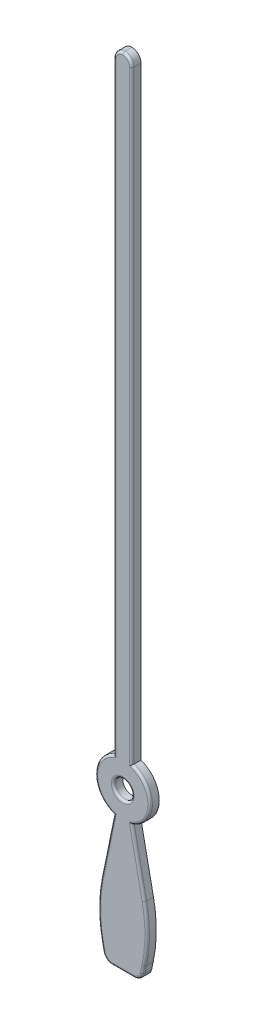
ISO-10303-21;
HEADER;
FILE_DESCRIPTION(('STEP AP214'),'2;1');
FILE_NAME('part.step','',(''),(''),'','','');
FILE_SCHEMA(('AUTOMOTIVE_DESIGN { 1 0 10303 214 1 1 1 1 }'));
ENDSEC;
DATA;
#1=APPLICATION_CONTEXT('core data for automotive mechanical design processes');
#2=APPLICATION_PROTOCOL_DEFINITION('international standard','automotive_design',2000,#1);
#3=PRODUCT_CONTEXT('',#1,'mechanical');
#4=PRODUCT('Part','Part','',(#3));
#5=PRODUCT_RELATED_PRODUCT_CATEGORY('part','',(#4));
#6=PRODUCT_DEFINITION_FORMATION('','',#4);
#7=PRODUCT_DEFINITION_CONTEXT('part definition',#1,'design');
#8=PRODUCT_DEFINITION('design','',#6,#7);
#9=PRODUCT_DEFINITION_SHAPE('','',#8);
#10=(LENGTH_UNIT() NAMED_UNIT(*) SI_UNIT(.MILLI.,.METRE.));
#11=(NAMED_UNIT(*) PLANE_ANGLE_UNIT() SI_UNIT($,.RADIAN.));
#12=(NAMED_UNIT(*) SI_UNIT($,.STERADIAN.) SOLID_ANGLE_UNIT());
#13=UNCERTAINTY_MEASURE_WITH_UNIT(LENGTH_MEASURE(1.E-05),#10,'distance_accuracy_value','');
#14=(GEOMETRIC_REPRESENTATION_CONTEXT(3) GLOBAL_UNCERTAINTY_ASSIGNED_CONTEXT((#13)) GLOBAL_UNIT_ASSIGNED_CONTEXT((#10,
#11,#12)) REPRESENTATION_CONTEXT('',''));
#15=CARTESIAN_POINT('',(0.,0.,0.));
#16=DIRECTION('',(0.,0.,1.));
#17=DIRECTION('',(1.,0.,0.));
#18=AXIS2_PLACEMENT_3D('',#15,#16,#17);
#19=CARTESIAN_POINT('',(0.,0.,0.2));
#20=DIRECTION('',(0.,0.,-1.));
#21=DIRECTION('',(-1.,0.,0.));
#22=AXIS2_PLACEMENT_3D('',#19,#20,#21);
#23=CYLINDRICAL_SURFACE('',#22,0.6);
#24=DIRECTION('',(0.,0.,1.));
#25=VECTOR('',#24,1.);
#26=CARTESIAN_POINT('',(0.2,0.565685424949238,0.));
#27=LINE('',#26,#25);
#28=CARTESIAN_POINT('',(0.2,0.565685424949238,0.));
#29=VERTEX_POINT('',#28);
#30=CARTESIAN_POINT('',(0.2,0.565685424949238,0.15));
#31=VERTEX_POINT('',#30);
#32=EDGE_CURVE('E537',#29,#31,#27,.T.);
#33=ORIENTED_EDGE('',*,*,#32,.T.);
#34=CARTESIAN_POINT('',(0.,0.,0.15));
#35=DIRECTION('',(0.,0.,1.));
#36=DIRECTION('',(1.,0.,0.));
#37=AXIS2_PLACEMENT_3D('',#34,#35,#36);
#38=CIRCLE('',#37,0.6);
#39=CARTESIAN_POINT('',(0.2,-0.565685424949238,0.15));
#40=VERTEX_POINT('',#39);
#41=EDGE_CURVE('E43',#31,#40,#38,.F.);
#42=ORIENTED_EDGE('',*,*,#41,.T.);
#43=DIRECTION('',(0.,0.,1.));
#44=VECTOR('',#43,1.);
#45=CARTESIAN_POINT('',(0.2,-0.565685424949238,0.));
#46=LINE('',#45,#44);
#47=CARTESIAN_POINT('',(0.2,-0.565685424949238,0.));
#48=VERTEX_POINT('',#47);
#49=EDGE_CURVE('E469',#48,#40,#46,.T.);
#50=ORIENTED_EDGE('',*,*,#49,.F.);
#51=CARTESIAN_POINT('',(0.,0.,0.));
#52=DIRECTION('',(0.,0.,1.));
#53=DIRECTION('',(1.,0.,0.));
#54=AXIS2_PLACEMENT_3D('',#51,#52,#53);
#55=CIRCLE('',#54,0.6);
#56=EDGE_CURVE('E219',#48,#29,#55,.T.);
#57=ORIENTED_EDGE('',*,*,#56,.T.);
#58=EDGE_LOOP('',(#33,#42,#50,#57));
#59=FACE_BOUND('',#58,.T.);
#60=ADVANCED_FACE('F34',(#59),#23,.T.);
#61=CARTESIAN_POINT('',(0.,0.,0.2));
#62=DIRECTION('',(0.,0.,1.));
#63=DIRECTION('',(1.,0.,0.));
#64=AXIS2_PLACEMENT_3D('',#61,#62,#63);
#65=PLANE('',#64);
#66=CARTESIAN_POINT('',(0.,0.,0.2));
#67=DIRECTION('',(0.,0.,1.));
#68=DIRECTION('',(1.,0.,0.));
#69=AXIS2_PLACEMENT_3D('',#66,#67,#68);
#70=CIRCLE('',#69,0.25);
#71=CARTESIAN_POINT('',(0.25,0.,0.2));
#72=VERTEX_POINT('',#71);
#73=EDGE_CURVE('E279',#72,#72,#70,.F.);
#74=ORIENTED_EDGE('',*,*,#73,.T.);
#75=EDGE_LOOP('',(#74));
#76=FACE_BOUND('',#75,.T.);
#77=CARTESIAN_POINT('',(0.,13.8,0.2));
#78=DIRECTION('',(0.,0.,1.));
#79=DIRECTION('',(1.,0.,0.));
#80=AXIS2_PLACEMENT_3D('',#77,#78,#79);
#81=CIRCLE('',#80,0.15);
#82=CARTESIAN_POINT('',(0.,13.95,0.2));
#83=VERTEX_POINT('',#82);
#84=CARTESIAN_POINT('',(-0.15,13.8,0.2));
#85=VERTEX_POINT('',#84);
#86=EDGE_CURVE('E274',#83,#85,#81,.T.);
#87=ORIENTED_EDGE('',*,*,#86,.T.);
#88=DIRECTION('',(0.,-1.,0.));
#89=VECTOR('',#88,1.);
#90=CARTESIAN_POINT('',(-0.15,0.,0.2));
#91=LINE('',#90,#89);
#92=CARTESIAN_POINT('',(-0.15,0.529150262212918,0.2));
#93=VERTEX_POINT('',#92);
#94=EDGE_CURVE('E276',#85,#93,#91,.T.);
#95=ORIENTED_EDGE('',*,*,#94,.T.);
#96=CARTESIAN_POINT('',(0.,0.,0.2));
#97=DIRECTION('',(0.,0.,1.));
#98=DIRECTION('',(1.,0.,0.));
#99=AXIS2_PLACEMENT_3D('',#96,#97,#98);
#100=CIRCLE('',#99,0.55);
#101=CARTESIAN_POINT('',(-0.141914989263031,-0.531375701196878,0.2));
#102=VERTEX_POINT('',#101);
#103=EDGE_CURVE('E270',#93,#102,#100,.T.);
#104=ORIENTED_EDGE('',*,*,#103,.T.);
#105=DIRECTION('',(-0.201071669364176,-0.979576532885054,0.));
#106=VECTOR('',#105,1.);
#107=CARTESIAN_POINT('',(-0.0315149301891181,0.00646887650968769,0.2));
#108=LINE('',#107,#106);
#109=CARTESIAN_POINT('',(-0.424628359130431,-1.90869247352332,0.2));
#110=VERTEX_POINT('',#109);
#111=EDGE_CURVE('E264',#102,#110,#108,.T.);
#112=ORIENTED_EDGE('',*,*,#111,.T.);
#113=CARTESIAN_POINT('',(2.46512241288048,-2.50185389814765,0.2));
#114=DIRECTION('',(0.,0.,1.));
#115=DIRECTION('',(1.,0.,0.));
#116=AXIS2_PLACEMENT_3D('',#113,#114,#115);
#117=CIRCLE('',#116,2.95);
#118=CARTESIAN_POINT('',(-0.419677137200519,-3.11864523713717,0.2));
#119=VERTEX_POINT('',#118);
#120=EDGE_CURVE('E262',#110,#119,#117,.T.);
#121=ORIENTED_EDGE('',*,*,#120,.T.);
#122=DIRECTION('',(0.209081809826953,-0.97789815256983,0.));
#123=VECTOR('',#122,1.);
#124=CARTESIAN_POINT('',(-1.03897130264992,-0.222139698030363,0.2));
#125=LINE('',#124,#123);
#126=CARTESIAN_POINT('',(-0.384925916389198,-3.28118044122338,0.2));
#127=VERTEX_POINT('',#126);
#128=EDGE_CURVE('E260',#119,#127,#125,.T.);
#129=ORIENTED_EDGE('',*,*,#128,.T.);
#130=CARTESIAN_POINT('',(-0.238241193503723,-3.24981816974934,0.2));
#131=DIRECTION('',(0.,0.,1.));
#132=DIRECTION('',(1.,0.,0.));
#133=AXIS2_PLACEMENT_3D('',#130,#131,#132);
#134=CIRCLE('',#133,0.15);
#135=CARTESIAN_POINT('',(-0.238241193503723,-3.39981816974934,0.2));
#136=VERTEX_POINT('',#135);
#137=EDGE_CURVE('E258',#127,#136,#134,.T.);
#138=ORIENTED_EDGE('',*,*,#137,.T.);
#139=DIRECTION('',(1.,0.,0.));
#140=VECTOR('',#139,1.);
#141=CARTESIAN_POINT('',(0.,-3.39981816974934,0.2));
#142=LINE('',#141,#140);
#143=CARTESIAN_POINT('',(0.238241193503723,-3.39981816974934,0.2));
#144=VERTEX_POINT('',#143);
#145=EDGE_CURVE('E256',#136,#144,#142,.T.);
#146=ORIENTED_EDGE('',*,*,#145,.T.);
#147=CARTESIAN_POINT('',(0.238241193503723,-3.24981816974934,0.2));
#148=DIRECTION('',(0.,0.,1.));
#149=DIRECTION('',(1.,0.,0.));
#150=AXIS2_PLACEMENT_3D('',#147,#148,#149);
#151=CIRCLE('',#150,0.15);
#152=CARTESIAN_POINT('',(0.384925916389198,-3.28118044122338,0.2));
#153=VERTEX_POINT('',#152);
#154=EDGE_CURVE('E254',#144,#153,#151,.T.);
#155=ORIENTED_EDGE('',*,*,#154,.T.);
#156=DIRECTION('',(0.209081809826953,0.97789815256983,0.));
#157=VECTOR('',#156,1.);
#158=CARTESIAN_POINT('',(1.03897130264992,-0.222139698030363,0.2));
#159=LINE('',#158,#157);
#160=CARTESIAN_POINT('',(0.419677137200518,-3.11864523713717,0.2));
#161=VERTEX_POINT('',#160);
#162=EDGE_CURVE('E252',#153,#161,#159,.T.);
#163=ORIENTED_EDGE('',*,*,#162,.T.);
#164=CARTESIAN_POINT('',(-2.46512241288048,-2.50185389814765,0.2));
#165=DIRECTION('',(0.,0.,1.));
#166=DIRECTION('',(1.,0.,0.));
#167=AXIS2_PLACEMENT_3D('',#164,#165,#166);
#168=CIRCLE('',#167,2.95);
#169=CARTESIAN_POINT('',(0.424628359130431,-1.90869247352332,0.2));
#170=VERTEX_POINT('',#169);
#171=EDGE_CURVE('E247',#161,#170,#168,.T.);
#172=ORIENTED_EDGE('',*,*,#171,.T.);
#173=DIRECTION('',(-0.201071669364176,0.979576532885054,0.));
#174=VECTOR('',#173,1.);
#175=CARTESIAN_POINT('',(0.0315149301891181,0.00646887650968768,0.2));
#176=LINE('',#175,#174);
#177=CARTESIAN_POINT('',(0.141914989263031,-0.531375701196878,0.2));
#178=VERTEX_POINT('',#177);
#179=EDGE_CURVE('E250',#170,#178,#176,.T.);
#180=ORIENTED_EDGE('',*,*,#179,.T.);
#181=CARTESIAN_POINT('',(0.,0.,0.2));
#182=DIRECTION('',(0.,0.,1.));
#183=DIRECTION('',(1.,0.,0.));
#184=AXIS2_PLACEMENT_3D('',#181,#182,#183);
#185=CIRCLE('',#184,0.55);
#186=CARTESIAN_POINT('',(0.15,0.529150262212918,0.2));
#187=VERTEX_POINT('',#186);
#188=EDGE_CURVE('E266',#178,#187,#185,.T.);
#189=ORIENTED_EDGE('',*,*,#188,.T.);
#190=DIRECTION('',(0.,1.,0.));
#191=VECTOR('',#190,1.);
#192=CARTESIAN_POINT('',(0.15,0.,0.2));
#193=LINE('',#192,#191);
#194=CARTESIAN_POINT('',(0.15,13.8,0.2));
#195=VERTEX_POINT('',#194);
#196=EDGE_CURVE('E268',#187,#195,#193,.T.);
#197=ORIENTED_EDGE('',*,*,#196,.T.);
#198=CARTESIAN_POINT('',(0.,13.8,0.2));
#199=DIRECTION('',(0.,0.,1.));
#200=DIRECTION('',(1.,0.,0.));
#201=AXIS2_PLACEMENT_3D('',#198,#199,#200);
#202=CIRCLE('',#201,0.15);
#203=EDGE_CURVE('E272',#195,#83,#202,.T.);
#204=ORIENTED_EDGE('',*,*,#203,.T.);
#205=EDGE_LOOP('',(#87,#95,#104,#112,#121,#129,#138,#146,#155,#163,#172,#180,#189,#197,#204));
#206=FACE_BOUND('',#205,.T.);
#207=ADVANCED_FACE('F414',(#76,#206),#65,.T.);
#208=CARTESIAN_POINT('',(0.,0.,0.));
#209=DIRECTION('',(0.,0.,1.));
#210=DIRECTION('',(1.,0.,0.));
#211=AXIS2_PLACEMENT_3D('',#208,#209,#210);
#212=PLANE('',#211);
#213=DIRECTION('',(0.,-1.,0.));
#214=VECTOR('',#213,1.);
#215=CARTESIAN_POINT('',(-0.2,0.565685424949238,0.));
#216=LINE('',#215,#214);
#217=CARTESIAN_POINT('',(-0.2,13.8,0.));
#218=VERTEX_POINT('',#217);
#219=CARTESIAN_POINT('',(-0.2,0.565685424949238,0.));
#220=VERTEX_POINT('',#219);
#221=EDGE_CURVE('E535',#218,#220,#216,.T.);
#222=ORIENTED_EDGE('',*,*,#221,.F.);
#223=CARTESIAN_POINT('',(0.,13.8,0.));
#224=DIRECTION('',(0.,0.,1.));
#225=DIRECTION('',(1.,0.,0.));
#226=AXIS2_PLACEMENT_3D('',#223,#224,#225);
#227=CIRCLE('',#226,0.2);
#228=CARTESIAN_POINT('',(0.,14.,0.));
#229=VERTEX_POINT('',#228);
#230=EDGE_CURVE('E232',#218,#229,#227,.F.);
#231=ORIENTED_EDGE('',*,*,#230,.T.);
#232=CARTESIAN_POINT('',(0.,13.8,0.));
#233=DIRECTION('',(0.,0.,1.));
#234=DIRECTION('',(1.,0.,0.));
#235=AXIS2_PLACEMENT_3D('',#232,#233,#234);
#236=CIRCLE('',#235,0.2);
#237=CARTESIAN_POINT('',(0.2,13.8,0.));
#238=VERTEX_POINT('',#237);
#239=EDGE_CURVE('E230',#229,#238,#236,.F.);
#240=ORIENTED_EDGE('',*,*,#239,.T.);
#241=DIRECTION('',(0.,1.,0.));
#242=VECTOR('',#241,1.);
#243=CARTESIAN_POINT('',(0.2,0.565685424949238,0.));
#244=LINE('',#243,#242);
#245=EDGE_CURVE('E474',#29,#238,#244,.T.);
#246=ORIENTED_EDGE('',*,*,#245,.F.);
#247=ORIENTED_EDGE('',*,*,#56,.F.);
#248=DIRECTION('',(-0.201071669364176,0.979576532885054,0.));
#249=VECTOR('',#248,1.);
#250=CARTESIAN_POINT('',(0.2,-0.565685424949238,0.));
#251=LINE('',#250,#249);
#252=CARTESIAN_POINT('',(0.473607185774684,-1.89863889005512,0.));
#253=VERTEX_POINT('',#252);
#254=EDGE_CURVE('E200',#253,#48,#251,.T.);
#255=ORIENTED_EDGE('',*,*,#254,.F.);
#256=CARTESIAN_POINT('',(-2.46512241288048,-2.50185389814765,0.));
#257=DIRECTION('',(0.,0.,1.));
#258=DIRECTION('',(1.,0.,0.));
#259=AXIS2_PLACEMENT_3D('',#256,#257,#258);
#260=CIRCLE('',#259,3.);
#261=CARTESIAN_POINT('',(0.46857204482901,-3.12909932762852,0.));
#262=VERTEX_POINT('',#261);
#263=EDGE_CURVE('E518',#262,#253,#260,.T.);
#264=ORIENTED_EDGE('',*,*,#263,.F.);
#265=DIRECTION('',(0.209081809826953,0.97789815256983,0.));
#266=VECTOR('',#265,1.);
#267=CARTESIAN_POINT('',(0.46857204482901,-3.12909932762852,0.));
#268=LINE('',#267,#266);
#269=CARTESIAN_POINT('',(0.433820824017689,-3.29163453171473,0.));
#270=VERTEX_POINT('',#269);
#271=EDGE_CURVE('E514',#270,#262,#268,.T.);
#272=ORIENTED_EDGE('',*,*,#271,.F.);
#273=CARTESIAN_POINT('',(0.238241193503723,-3.24981816974934,0.));
#274=DIRECTION('',(0.,0.,1.));
#275=DIRECTION('',(1.,0.,0.));
#276=AXIS2_PLACEMENT_3D('',#273,#274,#275);
#277=CIRCLE('',#276,0.2);
#278=CARTESIAN_POINT('',(0.238241193503723,-3.44981816974934,0.));
#279=VERTEX_POINT('',#278);
#280=EDGE_CURVE('E221',#270,#279,#277,.F.);
#281=ORIENTED_EDGE('',*,*,#280,.T.);
#282=DIRECTION('',(1.,0.,0.));
#283=VECTOR('',#282,1.);
#284=CARTESIAN_POINT('',(-0.4,-3.44981816974934,0.));
#285=LINE('',#284,#283);
#286=CARTESIAN_POINT('',(-0.238241193503723,-3.44981816974934,0.));
#287=VERTEX_POINT('',#286);
#288=EDGE_CURVE('E511',#287,#279,#285,.T.);
#289=ORIENTED_EDGE('',*,*,#288,.F.);
#290=CARTESIAN_POINT('',(-0.238241193503723,-3.24981816974934,0.));
#291=DIRECTION('',(0.,0.,1.));
#292=DIRECTION('',(1.,0.,0.));
#293=AXIS2_PLACEMENT_3D('',#290,#291,#292);
#294=CIRCLE('',#293,0.2);
#295=CARTESIAN_POINT('',(-0.433820824017689,-3.29163453171473,0.));
#296=VERTEX_POINT('',#295);
#297=EDGE_CURVE('E228',#287,#296,#294,.F.);
#298=ORIENTED_EDGE('',*,*,#297,.T.);
#299=DIRECTION('',(0.209081809826953,-0.97789815256983,0.));
#300=VECTOR('',#299,1.);
#301=CARTESIAN_POINT('',(-0.46857204482901,-3.12909932762852,0.));
#302=LINE('',#301,#300);
#303=CARTESIAN_POINT('',(-0.46857204482901,-3.12909932762852,0.));
#304=VERTEX_POINT('',#303);
#305=EDGE_CURVE('E516',#304,#296,#302,.T.);
#306=ORIENTED_EDGE('',*,*,#305,.F.);
#307=CARTESIAN_POINT('',(2.46512241288048,-2.50185389814765,0.));
#308=DIRECTION('',(0.,0.,1.));
#309=DIRECTION('',(1.,0.,0.));
#310=AXIS2_PLACEMENT_3D('',#307,#308,#309);
#311=CIRCLE('',#310,3.);
#312=CARTESIAN_POINT('',(-0.473607185774683,-1.89863889005512,0.));
#313=VERTEX_POINT('',#312);
#314=EDGE_CURVE('E211',#313,#304,#311,.T.);
#315=ORIENTED_EDGE('',*,*,#314,.F.);
#316=DIRECTION('',(-0.201071669364176,-0.979576532885054,0.));
#317=VECTOR('',#316,1.);
#318=CARTESIAN_POINT('',(-0.2,-0.565685424949238,0.));
#319=LINE('',#318,#317);
#320=CARTESIAN_POINT('',(-0.2,-0.565685424949238,0.));
#321=VERTEX_POINT('',#320);
#322=EDGE_CURVE('E193',#321,#313,#319,.T.);
#323=ORIENTED_EDGE('',*,*,#322,.F.);
#324=EDGE_CURVE('E208',#220,#321,#55,.T.);
#325=ORIENTED_EDGE('',*,*,#324,.F.);
#326=EDGE_LOOP('',(#222,#231,#240,#246,#247,#255,#264,#272,#281,#289,#298,#306,#315,#323,#325));
#327=FACE_BOUND('',#326,.T.);
#328=CARTESIAN_POINT('',(0.,0.,0.));
#329=DIRECTION('',(0.,0.,1.));
#330=DIRECTION('',(1.,0.,0.));
#331=AXIS2_PLACEMENT_3D('',#328,#329,#330);
#332=CIRCLE('',#331,0.2);
#333=CARTESIAN_POINT('',(0.2,0.,0.));
#334=VERTEX_POINT('',#333);
#335=EDGE_CURVE('E223',#334,#334,#332,.T.);
#336=ORIENTED_EDGE('',*,*,#335,.T.);
#337=EDGE_LOOP('',(#336));
#338=FACE_BOUND('',#337,.T.);
#339=ADVANCED_FACE('F206',(#327,#338),#212,.F.);
#340=DIRECTION('',(0.,0.,1.));
#341=VECTOR('',#340,1.);
#342=CARTESIAN_POINT('',(-0.2,-0.565685424949238,0.));
#343=LINE('',#342,#341);
#344=CARTESIAN_POINT('',(-0.2,-0.565685424949238,0.15));
#345=VERTEX_POINT('',#344);
#346=EDGE_CURVE('E189',#321,#345,#343,.T.);
#347=ORIENTED_EDGE('',*,*,#346,.T.);
#348=CARTESIAN_POINT('',(0.,0.,0.15));
#349=DIRECTION('',(0.,0.,1.));
#350=DIRECTION('',(1.,0.,0.));
#351=AXIS2_PLACEMENT_3D('',#348,#349,#350);
#352=CIRCLE('',#351,0.6);
#353=CARTESIAN_POINT('',(-0.2,0.565685424949238,0.15));
#354=VERTEX_POINT('',#353);
#355=EDGE_CURVE('E307',#345,#354,#352,.F.);
#356=ORIENTED_EDGE('',*,*,#355,.T.);
#357=DIRECTION('',(0.,0.,1.));
#358=VECTOR('',#357,1.);
#359=CARTESIAN_POINT('',(-0.2,0.565685424949238,0.));
#360=LINE('',#359,#358);
#361=EDGE_CURVE('E217',#220,#354,#360,.T.);
#362=ORIENTED_EDGE('',*,*,#361,.F.);
#363=ORIENTED_EDGE('',*,*,#324,.T.);
#364=EDGE_LOOP('',(#347,#356,#362,#363));
#365=FACE_BOUND('',#364,.T.);
#366=ADVANCED_FACE('F215',(#365),#23,.T.);
#367=CARTESIAN_POINT('',(0.,0.,0.2));
#368=DIRECTION('',(0.,0.,-1.));
#369=DIRECTION('',(-1.,0.,0.));
#370=AXIS2_PLACEMENT_3D('',#367,#368,#369);
#371=CYLINDRICAL_SURFACE('',#370,0.2);
#372=CARTESIAN_POINT('',(0.,0.,0.15));
#373=DIRECTION('',(0.,0.,1.));
#374=DIRECTION('',(1.,0.,0.));
#375=AXIS2_PLACEMENT_3D('',#372,#373,#374);
#376=CIRCLE('',#375,0.2);
#377=CARTESIAN_POINT('',(0.2,0.,0.15));
#378=VERTEX_POINT('',#377);
#379=EDGE_CURVE('E304',#378,#378,#376,.T.);
#380=ORIENTED_EDGE('',*,*,#379,.T.);
#381=EDGE_LOOP('',(#380));
#382=FACE_BOUND('',#381,.T.);
#383=ORIENTED_EDGE('',*,*,#335,.F.);
#384=EDGE_LOOP('',(#383));
#385=FACE_BOUND('',#384,.T.);
#386=ADVANCED_FACE('F424',(#382,#385),#371,.F.);
#387=CARTESIAN_POINT('',(-0.2,0.565685424949238,0.));
#388=DIRECTION('',(-1.,0.,0.));
#389=DIRECTION('',(0.,0.,1.));
#390=AXIS2_PLACEMENT_3D('',#387,#388,#389);
#391=PLANE('',#390);
#392=ORIENTED_EDGE('',*,*,#361,.T.);
#393=DIRECTION('',(0.,-1.,0.));
#394=VECTOR('',#393,1.);
#395=CARTESIAN_POINT('',(-0.2,0.565685424949238,0.15));
#396=LINE('',#395,#394);
#397=CARTESIAN_POINT('',(-0.2,13.8,0.15));
#398=VERTEX_POINT('',#397);
#399=EDGE_CURVE('E282',#354,#398,#396,.F.);
#400=ORIENTED_EDGE('',*,*,#399,.T.);
#401=DIRECTION('',(0.,0.,1.));
#402=VECTOR('',#401,1.);
#403=CARTESIAN_POINT('',(-0.2,13.8,0.));
#404=LINE('',#403,#402);
#405=EDGE_CURVE('E218',#398,#218,#404,.F.);
#406=ORIENTED_EDGE('',*,*,#405,.T.);
#407=ORIENTED_EDGE('',*,*,#221,.T.);
#408=EDGE_LOOP('',(#392,#400,#406,#407));
#409=FACE_BOUND('',#408,.T.);
#410=ADVANCED_FACE('F429',(#409),#391,.T.);
#411=CARTESIAN_POINT('',(0.2,0.565685424949238,0.));
#412=DIRECTION('',(1.,0.,0.));
#413=DIRECTION('',(0.,0.,-1.));
#414=AXIS2_PLACEMENT_3D('',#411,#412,#413);
#415=PLANE('',#414);
#416=DIRECTION('',(0.,0.,1.));
#417=VECTOR('',#416,1.);
#418=CARTESIAN_POINT('',(0.2,13.8,0.));
#419=LINE('',#418,#417);
#420=CARTESIAN_POINT('',(0.2,13.8,0.15));
#421=VERTEX_POINT('',#420);
#422=EDGE_CURVE('E235',#238,#421,#419,.T.);
#423=ORIENTED_EDGE('',*,*,#422,.T.);
#424=DIRECTION('',(0.,1.,0.));
#425=VECTOR('',#424,1.);
#426=CARTESIAN_POINT('',(0.2,0.565685424949238,0.15));
#427=LINE('',#426,#425);
#428=EDGE_CURVE('E51',#421,#31,#427,.F.);
#429=ORIENTED_EDGE('',*,*,#428,.T.);
#430=ORIENTED_EDGE('',*,*,#32,.F.);
#431=ORIENTED_EDGE('',*,*,#245,.T.);
#432=EDGE_LOOP('',(#423,#429,#430,#431));
#433=FACE_BOUND('',#432,.T.);
#434=ADVANCED_FACE('F435',(#433),#415,.T.);
#435=CARTESIAN_POINT('',(0.2,-0.565685424949238,0.));
#436=DIRECTION('',(0.979576532885054,0.201071669364176,0.));
#437=DIRECTION('',(-0.201071669364176,0.979576532885054,0.));
#438=AXIS2_PLACEMENT_3D('',#435,#436,#437);
#439=PLANE('',#438);
#440=ORIENTED_EDGE('',*,*,#49,.T.);
#441=DIRECTION('',(-0.201071669364176,0.979576532885054,0.));
#442=VECTOR('',#441,1.);
#443=CARTESIAN_POINT('',(0.2,-0.565685424949238,0.15));
#444=LINE('',#443,#442);
#445=CARTESIAN_POINT('',(0.473607185774684,-1.89863889005512,0.15));
#446=VERTEX_POINT('',#445);
#447=EDGE_CURVE('E302',#40,#446,#444,.F.);
#448=ORIENTED_EDGE('',*,*,#447,.T.);
#449=DIRECTION('',(0.,0.,1.));
#450=VECTOR('',#449,1.);
#451=CARTESIAN_POINT('',(0.473607185774684,-1.89863889005512,0.));
#452=LINE('',#451,#450);
#453=EDGE_CURVE('E475',#253,#446,#452,.T.);
#454=ORIENTED_EDGE('',*,*,#453,.F.);
#455=ORIENTED_EDGE('',*,*,#254,.T.);
#456=EDGE_LOOP('',(#440,#448,#454,#455));
#457=FACE_BOUND('',#456,.T.);
#458=ADVANCED_FACE('F438',(#457),#439,.T.);
#459=CARTESIAN_POINT('',(-2.46512241288048,-2.50185389814765,0.));
#460=DIRECTION('',(0.,0.,1.));
#461=DIRECTION('',(1.,0.,0.));
#462=AXIS2_PLACEMENT_3D('',#459,#460,#461);
#463=CYLINDRICAL_SURFACE('',#462,3.);
#464=ORIENTED_EDGE('',*,*,#453,.T.);
#465=CARTESIAN_POINT('',(-2.46512241288048,-2.50185389814765,0.15));
#466=DIRECTION('',(0.,0.,1.));
#467=DIRECTION('',(1.,0.,0.));
#468=AXIS2_PLACEMENT_3D('',#465,#466,#467);
#469=CIRCLE('',#468,3.);
#470=CARTESIAN_POINT('',(0.46857204482901,-3.12909932762852,0.15));
#471=VERTEX_POINT('',#470);
#472=EDGE_CURVE('E11',#446,#471,#469,.F.);
#473=ORIENTED_EDGE('',*,*,#472,.T.);
#474=DIRECTION('',(0.,0.,1.));
#475=VECTOR('',#474,1.);
#476=CARTESIAN_POINT('',(0.46857204482901,-3.12909932762852,0.));
#477=LINE('',#476,#475);
#478=EDGE_CURVE('E506',#262,#471,#477,.T.);
#479=ORIENTED_EDGE('',*,*,#478,.F.);
#480=ORIENTED_EDGE('',*,*,#263,.T.);
#481=EDGE_LOOP('',(#464,#473,#479,#480));
#482=FACE_BOUND('',#481,.T.);
#483=ADVANCED_FACE('F460',(#482),#463,.T.);
#484=CARTESIAN_POINT('',(0.46857204482901,-3.12909932762852,0.));
#485=DIRECTION('',(0.97789815256983,-0.209081809826953,0.));
#486=DIRECTION('',(0.209081809826953,0.97789815256983,0.));
#487=AXIS2_PLACEMENT_3D('',#484,#485,#486);
#488=PLANE('',#487);
#489=ORIENTED_EDGE('',*,*,#478,.T.);
#490=DIRECTION('',(0.209081809826953,0.97789815256983,0.));
#491=VECTOR('',#490,1.);
#492=CARTESIAN_POINT('',(0.46857204482901,-3.12909932762852,0.15));
#493=LINE('',#492,#491);
#494=CARTESIAN_POINT('',(0.433820824017689,-3.29163453171473,0.15));
#495=VERTEX_POINT('',#494);
#496=EDGE_CURVE('E300',#471,#495,#493,.F.);
#497=ORIENTED_EDGE('',*,*,#496,.T.);
#498=DIRECTION('',(0.,0.,1.));
#499=VECTOR('',#498,1.);
#500=CARTESIAN_POINT('',(0.433820824017689,-3.29163453171473,0.));
#501=LINE('',#500,#499);
#502=EDGE_CURVE('E245',#495,#270,#501,.F.);
#503=ORIENTED_EDGE('',*,*,#502,.T.);
#504=ORIENTED_EDGE('',*,*,#271,.T.);
#505=EDGE_LOOP('',(#489,#497,#503,#504));
#506=FACE_BOUND('',#505,.T.);
#507=ADVANCED_FACE('F456',(#506),#488,.T.);
#508=CARTESIAN_POINT('',(-0.4,-3.44981816974934,0.));
#509=DIRECTION('',(0.,-1.,0.));
#510=DIRECTION('',(0.,0.,-1.));
#511=AXIS2_PLACEMENT_3D('',#508,#509,#510);
#512=PLANE('',#511);
#513=DIRECTION('',(0.,0.,1.));
#514=VECTOR('',#513,1.);
#515=CARTESIAN_POINT('',(0.238241193503723,-3.44981816974934,0.));
#516=LINE('',#515,#514);
#517=CARTESIAN_POINT('',(0.238241193503723,-3.44981816974934,0.15));
#518=VERTEX_POINT('',#517);
#519=EDGE_CURVE('E240',#279,#518,#516,.T.);
#520=ORIENTED_EDGE('',*,*,#519,.T.);
#521=DIRECTION('',(1.,0.,0.));
#522=VECTOR('',#521,1.);
#523=CARTESIAN_POINT('',(-0.4,-3.44981816974934,0.15));
#524=LINE('',#523,#522);
#525=CARTESIAN_POINT('',(-0.238241193503723,-3.44981816974934,0.15));
#526=VERTEX_POINT('',#525);
#527=EDGE_CURVE('E296',#518,#526,#524,.F.);
#528=ORIENTED_EDGE('',*,*,#527,.T.);
#529=DIRECTION('',(0.,0.,1.));
#530=VECTOR('',#529,1.);
#531=CARTESIAN_POINT('',(-0.238241193503723,-3.44981816974934,0.));
#532=LINE('',#531,#530);
#533=EDGE_CURVE('E243',#526,#287,#532,.F.);
#534=ORIENTED_EDGE('',*,*,#533,.T.);
#535=ORIENTED_EDGE('',*,*,#288,.T.);
#536=EDGE_LOOP('',(#520,#528,#534,#535));
#537=FACE_BOUND('',#536,.T.);
#538=ADVANCED_FACE('F452',(#537),#512,.T.);
#539=CARTESIAN_POINT('',(-0.46857204482901,-3.12909932762852,0.));
#540=DIRECTION('',(-0.97789815256983,-0.209081809826953,0.));
#541=DIRECTION('',(0.209081809826953,-0.97789815256983,0.));
#542=AXIS2_PLACEMENT_3D('',#539,#540,#541);
#543=PLANE('',#542);
#544=DIRECTION('',(0.,0.,1.));
#545=VECTOR('',#544,1.);
#546=CARTESIAN_POINT('',(-0.433820824017689,-3.29163453171473,0.));
#547=LINE('',#546,#545);
#548=CARTESIAN_POINT('',(-0.433820824017689,-3.29163453171473,0.15));
#549=VERTEX_POINT('',#548);
#550=EDGE_CURVE('E237',#296,#549,#547,.T.);
#551=ORIENTED_EDGE('',*,*,#550,.T.);
#552=DIRECTION('',(0.209081809826953,-0.97789815256983,0.));
#553=VECTOR('',#552,1.);
#554=CARTESIAN_POINT('',(-0.46857204482901,-3.12909932762852,0.15));
#555=LINE('',#554,#553);
#556=CARTESIAN_POINT('',(-0.46857204482901,-3.12909932762852,0.15));
#557=VERTEX_POINT('',#556);
#558=EDGE_CURVE('E292',#549,#557,#555,.F.);
#559=ORIENTED_EDGE('',*,*,#558,.T.);
#560=DIRECTION('',(0.,0.,1.));
#561=VECTOR('',#560,1.);
#562=CARTESIAN_POINT('',(-0.46857204482901,-3.12909932762852,0.));
#563=LINE('',#562,#561);
#564=EDGE_CURVE('E529',#304,#557,#563,.T.);
#565=ORIENTED_EDGE('',*,*,#564,.F.);
#566=ORIENTED_EDGE('',*,*,#305,.T.);
#567=EDGE_LOOP('',(#551,#559,#565,#566));
#568=FACE_BOUND('',#567,.T.);
#569=ADVANCED_FACE('F448',(#568),#543,.T.);
#570=CARTESIAN_POINT('',(2.46512241288048,-2.50185389814765,0.));
#571=DIRECTION('',(0.,0.,1.));
#572=DIRECTION('',(1.,0.,0.));
#573=AXIS2_PLACEMENT_3D('',#570,#571,#572);
#574=CYLINDRICAL_SURFACE('',#573,3.);
#575=ORIENTED_EDGE('',*,*,#564,.T.);
#576=CARTESIAN_POINT('',(2.46512241288048,-2.50185389814765,0.15));
#577=DIRECTION('',(0.,0.,1.));
#578=DIRECTION('',(1.,0.,0.));
#579=AXIS2_PLACEMENT_3D('',#576,#577,#578);
#580=CIRCLE('',#579,3.);
#581=CARTESIAN_POINT('',(-0.473607185774683,-1.89863889005512,0.15));
#582=VERTEX_POINT('',#581);
#583=EDGE_CURVE('E290',#557,#582,#580,.F.);
#584=ORIENTED_EDGE('',*,*,#583,.T.);
#585=DIRECTION('',(0.,0.,1.));
#586=VECTOR('',#585,1.);
#587=CARTESIAN_POINT('',(-0.473607185774683,-1.89863889005512,0.));
#588=LINE('',#587,#586);
#589=EDGE_CURVE('E199',#313,#582,#588,.T.);
#590=ORIENTED_EDGE('',*,*,#589,.F.);
#591=ORIENTED_EDGE('',*,*,#314,.T.);
#592=EDGE_LOOP('',(#575,#584,#590,#591));
#593=FACE_BOUND('',#592,.T.);
#594=ADVANCED_FACE('F445',(#593),#574,.T.);
#595=CARTESIAN_POINT('',(-0.2,-0.565685424949238,0.));
#596=DIRECTION('',(-0.979576532885054,0.201071669364176,0.));
#597=DIRECTION('',(-0.201071669364176,-0.979576532885054,0.));
#598=AXIS2_PLACEMENT_3D('',#595,#596,#597);
#599=PLANE('',#598);
#600=ORIENTED_EDGE('',*,*,#589,.T.);
#601=DIRECTION('',(-0.201071669364176,-0.979576532885054,0.));
#602=VECTOR('',#601,1.);
#603=CARTESIAN_POINT('',(-0.2,-0.565685424949238,0.15));
#604=LINE('',#603,#602);
#605=EDGE_CURVE('E195',#582,#345,#604,.F.);
#606=ORIENTED_EDGE('',*,*,#605,.T.);
#607=ORIENTED_EDGE('',*,*,#346,.F.);
#608=ORIENTED_EDGE('',*,*,#322,.T.);
#609=EDGE_LOOP('',(#600,#606,#607,#608));
#610=FACE_BOUND('',#609,.T.);
#611=ADVANCED_FACE('F192',(#610),#599,.T.);
#612=CARTESIAN_POINT('',(0.,13.8,0.));
#613=DIRECTION('',(0.,0.,1.));
#614=DIRECTION('',(1.,0.,0.));
#615=AXIS2_PLACEMENT_3D('',#612,#613,#614);
#616=CYLINDRICAL_SURFACE('',#615,0.2);
#617=DIRECTION('',(0.,0.,1.));
#618=VECTOR('',#617,1.);
#619=CARTESIAN_POINT('',(0.,14.,0.));
#620=LINE('',#619,#618);
#621=CARTESIAN_POINT('',(0.,14.,0.15));
#622=VERTEX_POINT('',#621);
#623=EDGE_CURVE('E212',#622,#229,#620,.F.);
#624=ORIENTED_EDGE('',*,*,#623,.F.);
#625=CARTESIAN_POINT('',(0.,13.8,0.15));
#626=DIRECTION('',(0.,0.,1.));
#627=DIRECTION('',(1.,0.,0.));
#628=AXIS2_PLACEMENT_3D('',#625,#626,#627);
#629=CIRCLE('',#628,0.2);
#630=EDGE_CURVE('E287',#622,#421,#629,.F.);
#631=ORIENTED_EDGE('',*,*,#630,.T.);
#632=ORIENTED_EDGE('',*,*,#422,.F.);
#633=ORIENTED_EDGE('',*,*,#239,.F.);
#634=EDGE_LOOP('',(#624,#631,#632,#633));
#635=FACE_BOUND('',#634,.T.);
#636=ADVANCED_FACE('F444',(#635),#616,.T.);
#637=CARTESIAN_POINT('',(0.,13.8,0.));
#638=DIRECTION('',(0.,0.,1.));
#639=DIRECTION('',(1.,0.,0.));
#640=AXIS2_PLACEMENT_3D('',#637,#638,#639);
#641=CYLINDRICAL_SURFACE('',#640,0.2);
#642=ORIENTED_EDGE('',*,*,#405,.F.);
#643=CARTESIAN_POINT('',(0.,13.8,0.15));
#644=DIRECTION('',(0.,0.,1.));
#645=DIRECTION('',(1.,0.,0.));
#646=AXIS2_PLACEMENT_3D('',#643,#644,#645);
#647=CIRCLE('',#646,0.2);
#648=EDGE_CURVE('E285',#398,#622,#647,.F.);
#649=ORIENTED_EDGE('',*,*,#648,.T.);
#650=ORIENTED_EDGE('',*,*,#623,.T.);
#651=ORIENTED_EDGE('',*,*,#230,.F.);
#652=EDGE_LOOP('',(#642,#649,#650,#651));
#653=FACE_BOUND('',#652,.T.);
#654=ADVANCED_FACE('F579',(#653),#641,.T.);
#655=CARTESIAN_POINT('',(-0.238241193503723,-3.24981816974934,0.));
#656=DIRECTION('',(0.,0.,1.));
#657=DIRECTION('',(1.,0.,0.));
#658=AXIS2_PLACEMENT_3D('',#655,#656,#657);
#659=CYLINDRICAL_SURFACE('',#658,0.2);
#660=ORIENTED_EDGE('',*,*,#533,.F.);
#661=CARTESIAN_POINT('',(-0.238241193503723,-3.24981816974934,0.15));
#662=DIRECTION('',(0.,0.,1.));
#663=DIRECTION('',(1.,0.,0.));
#664=AXIS2_PLACEMENT_3D('',#661,#662,#663);
#665=CIRCLE('',#664,0.2);
#666=EDGE_CURVE('E294',#526,#549,#665,.F.);
#667=ORIENTED_EDGE('',*,*,#666,.T.);
#668=ORIENTED_EDGE('',*,*,#550,.F.);
#669=ORIENTED_EDGE('',*,*,#297,.F.);
#670=EDGE_LOOP('',(#660,#667,#668,#669));
#671=FACE_BOUND('',#670,.T.);
#672=ADVANCED_FACE('F410',(#671),#659,.T.);
#673=CARTESIAN_POINT('',(0.238241193503723,-3.24981816974934,0.));
#674=DIRECTION('',(0.,0.,1.));
#675=DIRECTION('',(1.,0.,0.));
#676=AXIS2_PLACEMENT_3D('',#673,#674,#675);
#677=CYLINDRICAL_SURFACE('',#676,0.2);
#678=ORIENTED_EDGE('',*,*,#502,.F.);
#679=CARTESIAN_POINT('',(0.238241193503723,-3.24981816974934,0.15));
#680=DIRECTION('',(0.,0.,1.));
#681=DIRECTION('',(1.,0.,0.));
#682=AXIS2_PLACEMENT_3D('',#679,#680,#681);
#683=CIRCLE('',#682,0.2);
#684=EDGE_CURVE('E298',#495,#518,#683,.F.);
#685=ORIENTED_EDGE('',*,*,#684,.T.);
#686=ORIENTED_EDGE('',*,*,#519,.F.);
#687=ORIENTED_EDGE('',*,*,#280,.F.);
#688=EDGE_LOOP('',(#678,#685,#686,#687));
#689=FACE_BOUND('',#688,.T.);
#690=ADVANCED_FACE('F405',(#689),#677,.T.);
#691=CARTESIAN_POINT('',(1.03897130264992,-0.222139698030363,0.15));
#692=DIRECTION('',(0.209081809826953,0.97789815256983,0.));
#693=DIRECTION('',(-0.97789815256983,0.209081809826953,0.));
#694=AXIS2_PLACEMENT_3D('',#691,#692,#693);
#695=CYLINDRICAL_SURFACE('',#694,0.05);
#696=CARTESIAN_POINT('',(0.419677137200518,-3.11864523713717,0.15));
#697=DIRECTION('',(0.20908180982695,0.97789815256983,0.));
#698=DIRECTION('',(-0.97789815256983,0.20908180982695,0.));
#699=AXIS2_PLACEMENT_3D('',#696,#697,#698);
#700=CIRCLE('',#699,0.05);
#701=EDGE_CURVE('E493',#161,#471,#700,.T.);
#702=ORIENTED_EDGE('',*,*,#701,.F.);
#703=ORIENTED_EDGE('',*,*,#162,.F.);
#704=CARTESIAN_POINT('',(0.384925916389198,-3.28118044122338,0.15));
#705=DIRECTION('',(-0.20908180982695,-0.97789815256983,0.));
#706=DIRECTION('',(0.97789815256983,-0.20908180982695,0.));
#707=AXIS2_PLACEMENT_3D('',#704,#705,#706);
#708=CIRCLE('',#707,0.05);
#709=EDGE_CURVE('E38',#495,#153,#708,.T.);
#710=ORIENTED_EDGE('',*,*,#709,.F.);
#711=ORIENTED_EDGE('',*,*,#496,.F.);
#712=EDGE_LOOP('',(#702,#703,#710,#711));
#713=FACE_BOUND('',#712,.T.);
#714=ADVANCED_FACE('F402',(#713),#695,.T.);
#715=CARTESIAN_POINT('',(0.238241193503723,-3.24981816974934,0.15));
#716=DIRECTION('',(0.,0.,1.));
#717=DIRECTION('',(1.,0.,0.));
#718=AXIS2_PLACEMENT_3D('',#715,#716,#717);
#719=TOROIDAL_SURFACE('',#718,0.15,0.05);
#720=ORIENTED_EDGE('',*,*,#709,.T.);
#721=ORIENTED_EDGE('',*,*,#154,.F.);
#722=CARTESIAN_POINT('',(0.238241193503723,-3.39981816974934,0.15));
#723=DIRECTION('',(-1.,0.,0.));
#724=DIRECTION('',(0.,0.,1.));
#725=AXIS2_PLACEMENT_3D('',#722,#723,#724);
#726=CIRCLE('',#725,0.05);
#727=EDGE_CURVE('E491',#518,#144,#726,.T.);
#728=ORIENTED_EDGE('',*,*,#727,.F.);
#729=ORIENTED_EDGE('',*,*,#684,.F.);
#730=EDGE_LOOP('',(#720,#721,#728,#729));
#731=FACE_BOUND('',#730,.T.);
#732=ADVANCED_FACE('F399',(#731),#719,.T.);
#733=CARTESIAN_POINT('',(-2.46512241288048,-2.50185389814765,0.15));
#734=DIRECTION('',(0.,0.,1.));
#735=DIRECTION('',(1.,0.,0.));
#736=AXIS2_PLACEMENT_3D('',#733,#734,#735);
#737=TOROIDAL_SURFACE('',#736,2.95,0.05);
#738=ORIENTED_EDGE('',*,*,#701,.T.);
#739=ORIENTED_EDGE('',*,*,#472,.F.);
#740=CARTESIAN_POINT('',(0.424628359130431,-1.90869247352332,0.15));
#741=DIRECTION('',(-0.201071669364175,0.979576532885054,0.));
#742=DIRECTION('',(-0.979576532885054,-0.201071669364175,0.));
#743=AXIS2_PLACEMENT_3D('',#740,#741,#742);
#744=CIRCLE('',#743,0.05);
#745=EDGE_CURVE('E482',#170,#446,#744,.T.);
#746=ORIENTED_EDGE('',*,*,#745,.F.);
#747=ORIENTED_EDGE('',*,*,#171,.F.);
#748=EDGE_LOOP('',(#738,#739,#746,#747));
#749=FACE_BOUND('',#748,.T.);
#750=ADVANCED_FACE('F395',(#749),#737,.T.);
#751=CARTESIAN_POINT('',(0.,-3.39981816974934,0.15));
#752=DIRECTION('',(1.,0.,0.));
#753=DIRECTION('',(0.,0.,-1.));
#754=AXIS2_PLACEMENT_3D('',#751,#752,#753);
#755=CYLINDRICAL_SURFACE('',#754,0.05);
#756=ORIENTED_EDGE('',*,*,#727,.T.);
#757=ORIENTED_EDGE('',*,*,#145,.F.);
#758=CARTESIAN_POINT('',(-0.238241193503723,-3.39981816974934,0.15));
#759=DIRECTION('',(-1.,0.,0.));
#760=DIRECTION('',(0.,0.,1.));
#761=AXIS2_PLACEMENT_3D('',#758,#759,#760);
#762=CIRCLE('',#761,0.05);
#763=EDGE_CURVE('E382',#526,#136,#762,.T.);
#764=ORIENTED_EDGE('',*,*,#763,.F.);
#765=ORIENTED_EDGE('',*,*,#527,.F.);
#766=EDGE_LOOP('',(#756,#757,#764,#765));
#767=FACE_BOUND('',#766,.T.);
#768=ADVANCED_FACE('F388',(#767),#755,.T.);
#769=CARTESIAN_POINT('',(0.0315149301891181,0.00646887650968768,0.15));
#770=DIRECTION('',(-0.201071669364176,0.979576532885054,0.));
#771=DIRECTION('',(-0.979576532885054,-0.201071669364176,0.));
#772=AXIS2_PLACEMENT_3D('',#769,#770,#771);
#773=CYLINDRICAL_SURFACE('',#772,0.05);
#774=ORIENTED_EDGE('',*,*,#745,.T.);
#775=ORIENTED_EDGE('',*,*,#447,.F.);
#776=CARTESIAN_POINT('',(0.2,-0.565685424949238,0.15));
#777=CARTESIAN_POINT('',(0.200004226267293,-0.565687658720492,0.152323712878078));
#778=CARTESIAN_POINT('',(0.199813240637721,-0.565579916777502,0.154642829296206));
#779=CARTESIAN_POINT('',(0.199076739342189,-0.565163564047056,0.159188964748397));
#780=CARTESIAN_POINT('',(0.198533784269882,-0.564856404010958,0.161416526344559));
#781=CARTESIAN_POINT('',(0.19712973816584,-0.564060614922595,0.165727656202832));
#782=CARTESIAN_POINT('',(0.196269287327082,-0.563572351034735,0.167811504278995));
#783=CARTESIAN_POINT('',(0.19427904419635,-0.562440095668967,0.171803010077409));
#784=CARTESIAN_POINT('',(0.193148766979818,-0.56179582378756,0.173710341905729));
#785=CARTESIAN_POINT('',(0.190249860185441,-0.560138337558199,0.177933890121864));
#786=CARTESIAN_POINT('',(0.1883945711784,-0.559074012290896,0.18017057462587));
#787=CARTESIAN_POINT('',(0.184398879938905,-0.556770538501471,0.184266882866563));
#788=CARTESIAN_POINT('',(0.182257996755405,-0.555531094860712,0.186125856900183));
#789=CARTESIAN_POINT('',(0.177056589749907,-0.552503396598403,0.19001041594243));
#790=CARTESIAN_POINT('',(0.173921449581392,-0.55066668149335,0.191897956116177));
#791=CARTESIAN_POINT('',(0.167445319048281,-0.546842633218746,0.195063649966941));
#792=CARTESIAN_POINT('',(0.164104141685435,-0.544855162836737,0.196341240584791));
#793=CARTESIAN_POINT('',(0.157822973407513,-0.541087931435231,0.198177573168352));
#794=CARTESIAN_POINT('',(0.154897403624262,-0.539321358768641,0.198815071412426));
#795=CARTESIAN_POINT('',(0.149019043712416,-0.535746176066285,0.199694657198942));
#796=CARTESIAN_POINT('',(0.146066311915775,-0.53393764723747,0.199937452920269));
#797=CARTESIAN_POINT('',(0.14271771917543,-0.531871691832649,0.199996463256231));
#798=CARTESIAN_POINT('',(0.142316273718972,-0.531623770150545,0.199999996099091));
#799=CARTESIAN_POINT('',(0.141914989263031,-0.531375701196878,0.2));
#800=B_SPLINE_CURVE_WITH_KNOTS('',3,(#776,#777,#778,#779,#780,#781,#782,#783,#784,#785,#786,
#787,#788,#789,#790,#791,#792,#793,#794,#795,#796,#797,#798,#799),.UNSPECIFIED.,.F.,.F.,(4,2,2,
2,2,2,2,2,2,2,2,4),(0.,0.00695353094220402,0.0138570338938248,0.0207466921390487,
0.0276488267589241,0.0368825782870816,0.0461320808592406,0.0583504612980703,0.0705800991140376,
0.0809871006134876,0.0913754090842252,0.0927908748883648),.UNSPECIFIED.);
#801=EDGE_CURVE('E376',#178,#40,#800,.F.);
#802=ORIENTED_EDGE('',*,*,#801,.F.);
#803=ORIENTED_EDGE('',*,*,#179,.F.);
#804=EDGE_LOOP('',(#774,#775,#802,#803));
#805=FACE_BOUND('',#804,.T.);
#806=ADVANCED_FACE('F384',(#805),#773,.T.);
#807=CARTESIAN_POINT('',(-0.238241193503723,-3.24981816974934,0.15));
#808=DIRECTION('',(0.,0.,1.));
#809=DIRECTION('',(1.,0.,0.));
#810=AXIS2_PLACEMENT_3D('',#807,#808,#809);
#811=TOROIDAL_SURFACE('',#810,0.15,0.05);
#812=ORIENTED_EDGE('',*,*,#763,.T.);
#813=ORIENTED_EDGE('',*,*,#137,.F.);
#814=CARTESIAN_POINT('',(-0.384925916389198,-3.28118044122338,0.15));
#815=DIRECTION('',(-0.20908180982695,0.97789815256983,0.));
#816=DIRECTION('',(-0.97789815256983,-0.20908180982695,0.));
#817=AXIS2_PLACEMENT_3D('',#814,#815,#816);
#818=CIRCLE('',#817,0.05);
#819=EDGE_CURVE('E362',#549,#127,#818,.T.);
#820=ORIENTED_EDGE('',*,*,#819,.F.);
#821=ORIENTED_EDGE('',*,*,#666,.F.);
#822=EDGE_LOOP('',(#812,#813,#820,#821));
#823=FACE_BOUND('',#822,.T.);
#824=ADVANCED_FACE('F372',(#823),#811,.T.);
#825=CARTESIAN_POINT('',(0.,0.,0.15));
#826=DIRECTION('',(0.,0.,1.));
#827=DIRECTION('',(1.,0.,0.));
#828=AXIS2_PLACEMENT_3D('',#825,#826,#827);
#829=TOROIDAL_SURFACE('',#828,0.55,0.05);
#830=ORIENTED_EDGE('',*,*,#801,.T.);
#831=ORIENTED_EDGE('',*,*,#41,.F.);
#832=CARTESIAN_POINT('',(0.2,0.565685424949238,0.15));
#833=CARTESIAN_POINT('',(0.200003525507459,0.56568776208982,0.152443504247441));
#834=CARTESIAN_POINT('',(0.199821131626433,0.565558947231571,0.15488345861538));
#835=CARTESIAN_POINT('',(0.199113538179786,0.565058349517029,0.159674437901617));
#836=CARTESIAN_POINT('',(0.198590205422524,0.56468788977196,0.162025873764223));
#837=CARTESIAN_POINT('',(0.19723009915895,0.563723598725012,0.166583026173976));
#838=CARTESIAN_POINT('',(0.196393736525185,0.563130060224583,0.168788929297536));
#839=CARTESIAN_POINT('',(0.194449882118271,0.561747617538949,0.173013426609625));
#840=CARTESIAN_POINT('',(0.193342079941065,0.560958489675969,0.175031802681643));
#841=CARTESIAN_POINT('',(0.190823320458501,0.559159648425703,0.1789701118318));
#842=CARTESIAN_POINT('',(0.189397505868942,0.558139055083993,0.180875492950687));
#843=CARTESIAN_POINT('',(0.186344616286313,0.555946846207001,0.184417163099097));
#844=CARTESIAN_POINT('',(0.184717501268485,0.554775200635905,0.186053398462966));
#845=CARTESIAN_POINT('',(0.181012713380468,0.552098047460393,0.189310342052007));
#846=CARTESIAN_POINT('',(0.178905841889793,0.550569879718754,0.190879136017523));
#847=CARTESIAN_POINT('',(0.174541454728487,0.547389898510569,0.193639421195699));
#848=CARTESIAN_POINT('',(0.172283739812014,0.545737921141567,0.194830400938078));
#849=CARTESIAN_POINT('',(0.166942361571604,0.541810717854399,0.197158428190381));
#850=CARTESIAN_POINT('',(0.163822964490818,0.539503378899094,0.198159749015567));
#851=CARTESIAN_POINT('',(0.157516538133648,0.534807192678015,0.199536851037174));
#852=CARTESIAN_POINT('',(0.154329620841139,0.532418476903083,0.199913596673111));
#853=CARTESIAN_POINT('',(0.150766864999708,0.529729721696995,0.199995590815624));
#854=CARTESIAN_POINT('',(0.150383337069653,0.52944004043663,0.199999999111697));
#855=CARTESIAN_POINT('',(0.15,0.529150262212918,0.2));
#856=B_SPLINE_CURVE_WITH_KNOTS('',3,(#832,#833,#834,#835,#836,#837,#838,#839,#840,#841,#842,
#843,#844,#845,#846,#847,#848,#849,#850,#851,#852,#853,#854,#855),.UNSPECIFIED.,.F.,.F.,(4,2,2,
2,2,2,2,2,2,2,2,4),(0.,0.00731473187869324,0.014589744856043,0.0218552421927298,
0.0291290870687901,0.0368681386679944,0.0446087315107135,0.0536918650853262,0.0627872430931571,
0.0747540263895955,0.0867023138738268,0.0881441807820407),.UNSPECIFIED.);
#857=EDGE_CURVE('E354',#187,#31,#856,.F.);
#858=ORIENTED_EDGE('',*,*,#857,.F.);
#859=ORIENTED_EDGE('',*,*,#188,.F.);
#860=EDGE_LOOP('',(#830,#831,#858,#859));
#861=FACE_BOUND('',#860,.T.);
#862=ADVANCED_FACE('F367',(#861),#829,.T.);
#863=CARTESIAN_POINT('',(-1.03897130264992,-0.222139698030363,0.15));
#864=DIRECTION('',(0.209081809826953,-0.97789815256983,0.));
#865=DIRECTION('',(0.97789815256983,0.209081809826953,0.));
#866=AXIS2_PLACEMENT_3D('',#863,#864,#865);
#867=CYLINDRICAL_SURFACE('',#866,0.05);
#868=ORIENTED_EDGE('',*,*,#819,.T.);
#869=ORIENTED_EDGE('',*,*,#128,.F.);
#870=CARTESIAN_POINT('',(-0.419677137200519,-3.11864523713717,0.15));
#871=DIRECTION('',(-0.20908180982695,0.97789815256983,0.));
#872=DIRECTION('',(-0.97789815256983,-0.20908180982695,0.));
#873=AXIS2_PLACEMENT_3D('',#870,#871,#872);
#874=CIRCLE('',#873,0.05);
#875=EDGE_CURVE('E351',#557,#119,#874,.T.);
#876=ORIENTED_EDGE('',*,*,#875,.F.);
#877=ORIENTED_EDGE('',*,*,#558,.F.);
#878=EDGE_LOOP('',(#868,#869,#876,#877));
#879=FACE_BOUND('',#878,.T.);
#880=ADVANCED_FACE('F371',(#879),#867,.T.);
#881=CARTESIAN_POINT('',(0.15,0.,0.15));
#882=DIRECTION('',(0.,1.,0.));
#883=DIRECTION('',(0.,0.,1.));
#884=AXIS2_PLACEMENT_3D('',#881,#882,#883);
#885=CYLINDRICAL_SURFACE('',#884,0.05);
#886=ORIENTED_EDGE('',*,*,#857,.T.);
#887=ORIENTED_EDGE('',*,*,#428,.F.);
#888=CARTESIAN_POINT('',(0.15,13.8,0.15));
#889=DIRECTION('',(0.,1.,0.));
#890=DIRECTION('',(0.,0.,1.));
#891=AXIS2_PLACEMENT_3D('',#888,#889,#890);
#892=CIRCLE('',#891,0.05);
#893=EDGE_CURVE('E348',#195,#421,#892,.T.);
#894=ORIENTED_EDGE('',*,*,#893,.F.);
#895=ORIENTED_EDGE('',*,*,#196,.F.);
#896=EDGE_LOOP('',(#886,#887,#894,#895));
#897=FACE_BOUND('',#896,.T.);
#898=ADVANCED_FACE('F364',(#897),#885,.T.);
#899=CARTESIAN_POINT('',(2.46512241288048,-2.50185389814765,0.15));
#900=DIRECTION('',(0.,0.,1.));
#901=DIRECTION('',(1.,0.,0.));
#902=AXIS2_PLACEMENT_3D('',#899,#900,#901);
#903=TOROIDAL_SURFACE('',#902,2.95,0.05);
#904=ORIENTED_EDGE('',*,*,#875,.T.);
#905=ORIENTED_EDGE('',*,*,#120,.F.);
#906=CARTESIAN_POINT('',(-0.424628359130431,-1.90869247352332,0.15));
#907=DIRECTION('',(0.201071669364179,0.979576532885054,0.));
#908=DIRECTION('',(-0.979576532885054,0.201071669364179,0.));
#909=AXIS2_PLACEMENT_3D('',#906,#907,#908);
#910=CIRCLE('',#909,0.05);
#911=EDGE_CURVE('E345',#582,#110,#910,.T.);
#912=ORIENTED_EDGE('',*,*,#911,.F.);
#913=ORIENTED_EDGE('',*,*,#583,.F.);
#914=EDGE_LOOP('',(#904,#905,#912,#913));
#915=FACE_BOUND('',#914,.T.);
#916=ADVANCED_FACE('F564',(#915),#903,.T.);
#917=CARTESIAN_POINT('',(0.,13.8,0.15));
#918=DIRECTION('',(0.,0.,1.));
#919=DIRECTION('',(1.,0.,0.));
#920=AXIS2_PLACEMENT_3D('',#917,#918,#919);
#921=TOROIDAL_SURFACE('',#920,0.15,0.05);
#922=ORIENTED_EDGE('',*,*,#893,.T.);
#923=ORIENTED_EDGE('',*,*,#630,.F.);
#924=CARTESIAN_POINT('',(0.,13.95,0.15));
#925=DIRECTION('',(-1.,0.,0.));
#926=DIRECTION('',(0.,0.,1.));
#927=AXIS2_PLACEMENT_3D('',#924,#925,#926);
#928=CIRCLE('',#927,0.05);
#929=EDGE_CURVE('E342',#83,#622,#928,.T.);
#930=ORIENTED_EDGE('',*,*,#929,.F.);
#931=ORIENTED_EDGE('',*,*,#203,.F.);
#932=EDGE_LOOP('',(#922,#923,#930,#931));
#933=FACE_BOUND('',#932,.T.);
#934=ADVANCED_FACE('F333',(#933),#921,.T.);
#935=CARTESIAN_POINT('',(-0.0315149301891181,0.00646887650968768,0.15));
#936=DIRECTION('',(-0.201071669364176,-0.979576532885054,0.));
#937=DIRECTION('',(0.979576532885054,-0.201071669364176,0.));
#938=AXIS2_PLACEMENT_3D('',#935,#936,#937);
#939=CYLINDRICAL_SURFACE('',#938,0.05);
#940=ORIENTED_EDGE('',*,*,#911,.T.);
#941=ORIENTED_EDGE('',*,*,#111,.F.);
#942=CARTESIAN_POINT('',(-0.2,-0.565685424949238,0.15));
#943=CARTESIAN_POINT('',(-0.200004226267293,-0.565687658720492,0.152323712878078));
#944=CARTESIAN_POINT('',(-0.199813240637721,-0.565579916777502,0.154642829296206));
#945=CARTESIAN_POINT('',(-0.199076739342189,-0.565163564047056,0.159188964748397));
#946=CARTESIAN_POINT('',(-0.198533784269882,-0.564856404010958,0.161416526344559));
#947=CARTESIAN_POINT('',(-0.19712973816584,-0.564060614922595,0.165727656202832));
#948=CARTESIAN_POINT('',(-0.196269287327082,-0.563572351034735,0.167811504278995));
#949=CARTESIAN_POINT('',(-0.19427904419635,-0.562440095668967,0.171803010077409));
#950=CARTESIAN_POINT('',(-0.193148766979818,-0.56179582378756,0.173710341905729));
#951=CARTESIAN_POINT('',(-0.190249860185441,-0.560138337558199,0.177933890121864));
#952=CARTESIAN_POINT('',(-0.1883945711784,-0.559074012290896,0.18017057462587));
#953=CARTESIAN_POINT('',(-0.184398879938905,-0.556770538501471,0.184266882866563));
#954=CARTESIAN_POINT('',(-0.182257996755405,-0.555531094860712,0.186125856900183));
#955=CARTESIAN_POINT('',(-0.177056589749907,-0.552503396598403,0.19001041594243));
#956=CARTESIAN_POINT('',(-0.173921449581392,-0.55066668149335,0.191897956116177));
#957=CARTESIAN_POINT('',(-0.167445319048281,-0.546842633218746,0.195063649966941));
#958=CARTESIAN_POINT('',(-0.164104141685435,-0.544855162836737,0.196341240584791));
#959=CARTESIAN_POINT('',(-0.157822973407513,-0.541087931435231,0.198177573168352));
#960=CARTESIAN_POINT('',(-0.154897403624262,-0.539321358768641,0.198815071412426));
#961=CARTESIAN_POINT('',(-0.149019043712416,-0.535746176066285,0.199694657198942));
#962=CARTESIAN_POINT('',(-0.146066311915775,-0.53393764723747,0.199937452920269));
#963=CARTESIAN_POINT('',(-0.14271771917543,-0.531871691832649,0.199996463256231));
#964=CARTESIAN_POINT('',(-0.142316273718972,-0.531623770150545,0.199999996099091));
#965=CARTESIAN_POINT('',(-0.141914989263031,-0.531375701196878,0.2));
#966=B_SPLINE_CURVE_WITH_KNOTS('',3,(#942,#943,#944,#945,#946,#947,#948,#949,#950,#951,#952,
#953,#954,#955,#956,#957,#958,#959,#960,#961,#962,#963,#964,#965),.UNSPECIFIED.,.F.,.F.,(4,2,2,
2,2,2,2,2,2,2,2,4),(0.,0.00695353094220402,0.0138570338938248,0.0207466921390487,
0.0276488267589241,0.0368825782870816,0.0461320808592406,0.0583504612980703,0.0705800991140376,
0.0809871006134876,0.0913754090842252,0.0927908748883648),.UNSPECIFIED.);
#967=EDGE_CURVE('E336',#345,#102,#966,.T.);
#968=ORIENTED_EDGE('',*,*,#967,.F.);
#969=ORIENTED_EDGE('',*,*,#605,.F.);
#970=EDGE_LOOP('',(#940,#941,#968,#969));
#971=FACE_BOUND('',#970,.T.);
#972=ADVANCED_FACE('F328',(#971),#939,.T.);
#973=CARTESIAN_POINT('',(0.,13.8,0.15));
#974=DIRECTION('',(0.,0.,1.));
#975=DIRECTION('',(1.,0.,0.));
#976=AXIS2_PLACEMENT_3D('',#973,#974,#975);
#977=TOROIDAL_SURFACE('',#976,0.15,0.05);
#978=ORIENTED_EDGE('',*,*,#929,.T.);
#979=ORIENTED_EDGE('',*,*,#648,.F.);
#980=CARTESIAN_POINT('',(-0.15,13.8,0.15));
#981=DIRECTION('',(0.,-1.,0.));
#982=DIRECTION('',(0.,0.,-1.));
#983=AXIS2_PLACEMENT_3D('',#980,#981,#982);
#984=CIRCLE('',#983,0.05);
#985=EDGE_CURVE('E318',#85,#398,#984,.T.);
#986=ORIENTED_EDGE('',*,*,#985,.F.);
#987=ORIENTED_EDGE('',*,*,#86,.F.);
#988=EDGE_LOOP('',(#978,#979,#986,#987));
#989=FACE_BOUND('',#988,.T.);
#990=ADVANCED_FACE('F332',(#989),#977,.T.);
#991=CARTESIAN_POINT('',(0.,0.,0.15));
#992=DIRECTION('',(0.,0.,1.));
#993=DIRECTION('',(1.,0.,0.));
#994=AXIS2_PLACEMENT_3D('',#991,#992,#993);
#995=TOROIDAL_SURFACE('',#994,0.55,0.05);
#996=ORIENTED_EDGE('',*,*,#967,.T.);
#997=ORIENTED_EDGE('',*,*,#103,.F.);
#998=CARTESIAN_POINT('',(-0.2,0.565685424949238,0.15));
#999=CARTESIAN_POINT('',(-0.200003525507459,0.56568776208982,0.152443504247441));
#1000=CARTESIAN_POINT('',(-0.199821131626433,0.565558947231571,0.15488345861538));
#1001=CARTESIAN_POINT('',(-0.199113538179786,0.565058349517029,0.159674437901617));
#1002=CARTESIAN_POINT('',(-0.198590205422524,0.56468788977196,0.162025873764223));
#1003=CARTESIAN_POINT('',(-0.19723009915895,0.563723598725012,0.166583026173976));
#1004=CARTESIAN_POINT('',(-0.196393736525185,0.563130060224583,0.168788929297536));
#1005=CARTESIAN_POINT('',(-0.194449882118271,0.561747617538949,0.173013426609625));
#1006=CARTESIAN_POINT('',(-0.193342079941065,0.560958489675969,0.175031802681643));
#1007=CARTESIAN_POINT('',(-0.190823320458501,0.559159648425703,0.1789701118318));
#1008=CARTESIAN_POINT('',(-0.189397505868942,0.558139055083993,0.180875492950687));
#1009=CARTESIAN_POINT('',(-0.186344616286313,0.555946846207001,0.184417163099097));
#1010=CARTESIAN_POINT('',(-0.184717501268485,0.554775200635905,0.186053398462966));
#1011=CARTESIAN_POINT('',(-0.181012713380468,0.552098047460393,0.189310342052007));
#1012=CARTESIAN_POINT('',(-0.178905841889793,0.550569879718754,0.190879136017523));
#1013=CARTESIAN_POINT('',(-0.174541454728487,0.547389898510569,0.193639421195699));
#1014=CARTESIAN_POINT('',(-0.172283739812014,0.545737921141567,0.194830400938078));
#1015=CARTESIAN_POINT('',(-0.166942361571604,0.541810717854399,0.197158428190381));
#1016=CARTESIAN_POINT('',(-0.163822964490818,0.539503378899094,0.198159749015567));
#1017=CARTESIAN_POINT('',(-0.157516538133648,0.534807192678015,0.199536851037174));
#1018=CARTESIAN_POINT('',(-0.154329620841139,0.532418476903083,0.199913596673111));
#1019=CARTESIAN_POINT('',(-0.150766864999708,0.529729721696995,0.199995590815624));
#1020=CARTESIAN_POINT('',(-0.150383337069653,0.52944004043663,0.199999999111697));
#1021=CARTESIAN_POINT('',(-0.15,0.529150262212918,0.2));
#1022=B_SPLINE_CURVE_WITH_KNOTS('',3,(#998,#999,#1000,#1001,#1002,#1003,#1004,#1005,#1006,#1007,
#1008,#1009,#1010,#1011,#1012,#1013,#1014,#1015,#1016,#1017,#1018,#1019,#1020,#1021),
.UNSPECIFIED.,.F.,.F.,(4,2,2,2,2,2,2,2,2,2,2,4),(0.,0.00731473187869324,0.014589744856043,
0.0218552421927298,0.0291290870687901,0.0368681386679944,0.0446087315107135,0.0536918650853262,
0.0627872430931571,0.0747540263895955,0.0867023138738268,0.0881441807820407),.UNSPECIFIED.);
#1023=EDGE_CURVE('E311',#354,#93,#1022,.T.);
#1024=ORIENTED_EDGE('',*,*,#1023,.F.);
#1025=ORIENTED_EDGE('',*,*,#355,.F.);
#1026=EDGE_LOOP('',(#996,#997,#1024,#1025));
#1027=FACE_BOUND('',#1026,.T.);
#1028=ADVANCED_FACE('F320',(#1027),#995,.T.);
#1029=CARTESIAN_POINT('',(-0.15,0.,0.15));
#1030=DIRECTION('',(0.,-1.,0.));
#1031=DIRECTION('',(0.,0.,-1.));
#1032=AXIS2_PLACEMENT_3D('',#1029,#1030,#1031);
#1033=CYLINDRICAL_SURFACE('',#1032,0.05);
#1034=ORIENTED_EDGE('',*,*,#985,.T.);
#1035=ORIENTED_EDGE('',*,*,#399,.F.);
#1036=ORIENTED_EDGE('',*,*,#1023,.T.);
#1037=ORIENTED_EDGE('',*,*,#94,.F.);
#1038=EDGE_LOOP('',(#1034,#1035,#1036,#1037));
#1039=FACE_BOUND('',#1038,.T.);
#1040=ADVANCED_FACE('F323',(#1039),#1033,.T.);
#1041=CARTESIAN_POINT('',(0.,0.,0.15));
#1042=DIRECTION('',(0.,0.,1.));
#1043=DIRECTION('',(1.,0.,0.));
#1044=AXIS2_PLACEMENT_3D('',#1041,#1042,#1043);
#1045=TOROIDAL_SURFACE('',#1044,0.25,0.05);
#1046=ORIENTED_EDGE('',*,*,#73,.F.);
#1047=EDGE_LOOP('',(#1046));
#1048=FACE_BOUND('',#1047,.T.);
#1049=ORIENTED_EDGE('',*,*,#379,.F.);
#1050=EDGE_LOOP('',(#1049));
#1051=FACE_BOUND('',#1050,.T.);
#1052=ADVANCED_FACE('F36',(#1048,#1051),#1045,.T.);
#1053=CLOSED_SHELL('',(#60,#207,#339,#366,#386,#410,#434,#458,#483,#507,#538,#569,#594,#611,
#636,#654,#672,#690,#714,#732,#750,#768,#806,#824,#862,#880,#898,#916,#934,#972,#990,#1028,
#1040,#1052));
#1054=MANIFOLD_SOLID_BREP('B2',#1053);
#1055=ADVANCED_BREP_SHAPE_REPRESENTATION('',(#18,#1054),#14);
#1056=SHAPE_DEFINITION_REPRESENTATION(#9,#1055);
ENDSEC;
END-ISO-10303-21;
